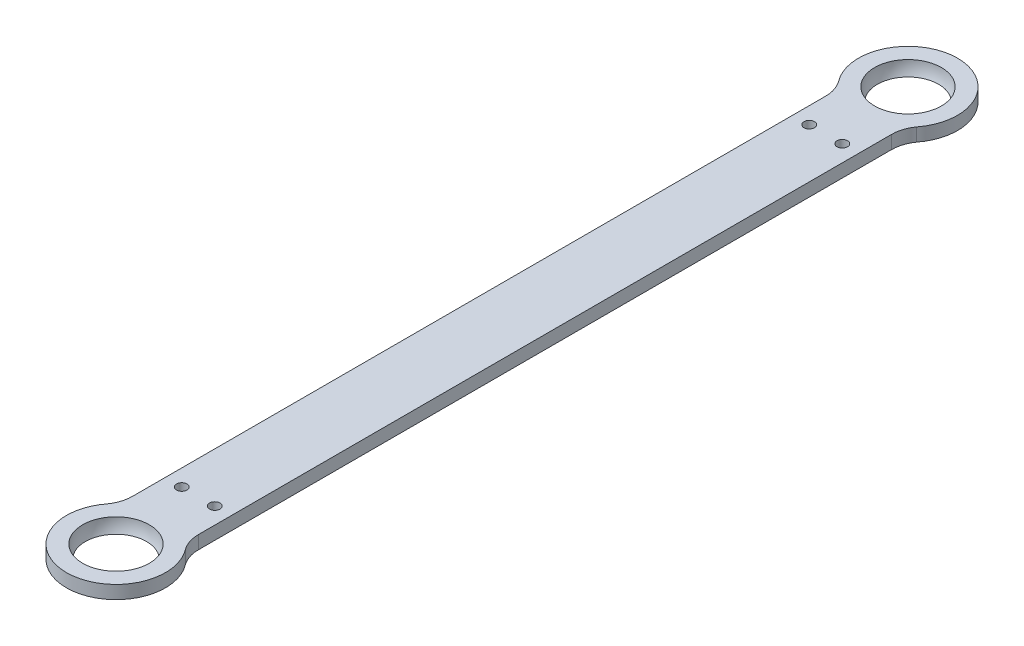
ISO-10303-21;
HEADER;
FILE_DESCRIPTION(('STEP AP214'),'2;1');
FILE_NAME('part.step','',(''),(''),'','','');
FILE_SCHEMA(('AUTOMOTIVE_DESIGN { 1 0 10303 214 1 1 1 1 }'));
ENDSEC;
DATA;
#1=APPLICATION_CONTEXT('core data for automotive mechanical design processes');
#2=APPLICATION_PROTOCOL_DEFINITION('international standard','automotive_design',2000,#1);
#3=PRODUCT_CONTEXT('',#1,'mechanical');
#4=PRODUCT('Part','Part','',(#3));
#5=PRODUCT_RELATED_PRODUCT_CATEGORY('part','',(#4));
#6=PRODUCT_DEFINITION_FORMATION('','',#4);
#7=PRODUCT_DEFINITION_CONTEXT('part definition',#1,'design');
#8=PRODUCT_DEFINITION('design','',#6,#7);
#9=PRODUCT_DEFINITION_SHAPE('','',#8);
#10=(LENGTH_UNIT() NAMED_UNIT(*) SI_UNIT(.MILLI.,.METRE.));
#11=(NAMED_UNIT(*) PLANE_ANGLE_UNIT() SI_UNIT($,.RADIAN.));
#12=(NAMED_UNIT(*) SI_UNIT($,.STERADIAN.) SOLID_ANGLE_UNIT());
#13=UNCERTAINTY_MEASURE_WITH_UNIT(LENGTH_MEASURE(1.E-05),#10,'distance_accuracy_value','');
#14=(GEOMETRIC_REPRESENTATION_CONTEXT(3) GLOBAL_UNCERTAINTY_ASSIGNED_CONTEXT((#13)) GLOBAL_UNIT_ASSIGNED_CONTEXT((#10,
#11,#12)) REPRESENTATION_CONTEXT('',''));
#15=CARTESIAN_POINT('',(0.,0.,0.));
#16=DIRECTION('',(0.,0.,1.));
#17=DIRECTION('',(1.,0.,0.));
#18=AXIS2_PLACEMENT_3D('',#15,#16,#17);
#19=CARTESIAN_POINT('',(10.,4.,15.));
#20=DIRECTION('',(-1.,0.,0.));
#21=DIRECTION('',(0.,0.,1.));
#22=AXIS2_PLACEMENT_3D('',#19,#20,#21);
#23=PLANE('',#22);
#24=DIRECTION('',(0.,0.,-1.));
#25=VECTOR('',#24,1.);
#26=CARTESIAN_POINT('',(10.,4.,15.));
#27=LINE('',#26,#25);
#28=CARTESIAN_POINT('',(10.,4.,224.807386353478));
#29=VERTEX_POINT('',#28);
#30=CARTESIAN_POINT('',(10.,4.,15.));
#31=VERTEX_POINT('',#30);
#32=EDGE_CURVE('E92',#29,#31,#27,.T.);
#33=ORIENTED_EDGE('',*,*,#32,.F.);
#34=DIRECTION('',(0.,-1.,0.));
#35=VECTOR('',#34,1.);
#36=CARTESIAN_POINT('',(10.,4.,224.807386353478));
#37=LINE('',#36,#35);
#38=CARTESIAN_POINT('',(10.,0.,224.807386353478));
#39=VERTEX_POINT('',#38);
#40=EDGE_CURVE('E118',#29,#39,#37,.T.);
#41=ORIENTED_EDGE('',*,*,#40,.T.);
#42=DIRECTION('',(0.,0.,-1.));
#43=VECTOR('',#42,1.);
#44=CARTESIAN_POINT('',(10.,0.,15.));
#45=LINE('',#44,#43);
#46=CARTESIAN_POINT('',(10.,0.,15.));
#47=VERTEX_POINT('',#46);
#48=EDGE_CURVE('E163',#39,#47,#45,.T.);
#49=ORIENTED_EDGE('',*,*,#48,.T.);
#50=DIRECTION('',(0.,-1.,0.));
#51=VECTOR('',#50,1.);
#52=CARTESIAN_POINT('',(10.,4.,15.));
#53=LINE('',#52,#51);
#54=EDGE_CURVE('E11',#31,#47,#53,.T.);
#55=ORIENTED_EDGE('',*,*,#54,.F.);
#56=EDGE_LOOP('',(#33,#41,#49,#55));
#57=FACE_BOUND('',#56,.T.);
#58=ADVANCED_FACE('F44',(#57),#23,.F.);
#59=CARTESIAN_POINT('',(20.0290905482833,4.,15.));
#60=DIRECTION('',(0.,-1.,0.));
#61=DIRECTION('',(0.,0.,-1.));
#62=AXIS2_PLACEMENT_3D('',#59,#60,#61);
#63=CYLINDRICAL_SURFACE('',#62,10.0290905482833);
#64=CARTESIAN_POINT('',(20.0290905482833,0.,15.));
#65=DIRECTION('',(0.,-1.,0.));
#66=DIRECTION('',(0.,0.,-1.));
#67=AXIS2_PLACEMENT_3D('',#64,#65,#66);
#68=CIRCLE('',#67,10.0290905482833);
#69=CARTESIAN_POINT('',(11.8459761773143,0.,9.20178506630661));
#70=VERTEX_POINT('',#69);
#71=EDGE_CURVE('E173',#47,#70,#68,.T.);
#72=ORIENTED_EDGE('',*,*,#71,.T.);
#73=DIRECTION('',(0.,-1.,0.));
#74=VECTOR('',#73,1.);
#75=CARTESIAN_POINT('',(11.8459761773143,4.,9.20178506630661));
#76=LINE('',#75,#74);
#77=CARTESIAN_POINT('',(11.8459761773143,4.,9.20178506630661));
#78=VERTEX_POINT('',#77);
#79=EDGE_CURVE('E53',#78,#70,#76,.T.);
#80=ORIENTED_EDGE('',*,*,#79,.F.);
#81=CARTESIAN_POINT('',(20.0290905482833,4.,15.));
#82=DIRECTION('',(0.,-1.,0.));
#83=DIRECTION('',(0.,0.,-1.));
#84=AXIS2_PLACEMENT_3D('',#81,#82,#83);
#85=CIRCLE('',#84,10.0290905482833);
#86=EDGE_CURVE('E120',#31,#78,#85,.T.);
#87=ORIENTED_EDGE('',*,*,#86,.F.);
#88=ORIENTED_EDGE('',*,*,#54,.T.);
#89=EDGE_LOOP('',(#72,#80,#87,#88));
#90=FACE_BOUND('',#89,.T.);
#91=ADVANCED_FACE('F244',(#90),#63,.F.);
#92=CARTESIAN_POINT('',(0.,4.,0.));
#93=DIRECTION('',(0.,-1.,0.));
#94=DIRECTION('',(0.,0.,-1.));
#95=AXIS2_PLACEMENT_3D('',#92,#93,#94);
#96=CYLINDRICAL_SURFACE('',#95,15.);
#97=CARTESIAN_POINT('',(0.,0.,0.));
#98=DIRECTION('',(0.,1.,0.));
#99=DIRECTION('',(0.,0.,1.));
#100=AXIS2_PLACEMENT_3D('',#97,#98,#99);
#101=CIRCLE('',#100,15.);
#102=CARTESIAN_POINT('',(-11.8459761773142,0.,9.20178506630661));
#103=VERTEX_POINT('',#102);
#104=EDGE_CURVE('E79',#70,#103,#101,.T.);
#105=ORIENTED_EDGE('',*,*,#104,.T.);
#106=DIRECTION('',(0.,-1.,0.));
#107=VECTOR('',#106,1.);
#108=CARTESIAN_POINT('',(-11.8459761773142,4.,9.20178506630661));
#109=LINE('',#108,#107);
#110=CARTESIAN_POINT('',(-11.8459761773142,4.,9.20178506630661));
#111=VERTEX_POINT('',#110);
#112=EDGE_CURVE('E179',#111,#103,#109,.T.);
#113=ORIENTED_EDGE('',*,*,#112,.F.);
#114=CARTESIAN_POINT('',(0.,4.,0.));
#115=DIRECTION('',(0.,1.,0.));
#116=DIRECTION('',(0.,0.,1.));
#117=AXIS2_PLACEMENT_3D('',#114,#115,#116);
#118=CIRCLE('',#117,15.);
#119=EDGE_CURVE('E166',#78,#111,#118,.T.);
#120=ORIENTED_EDGE('',*,*,#119,.F.);
#121=ORIENTED_EDGE('',*,*,#79,.T.);
#122=EDGE_LOOP('',(#105,#113,#120,#121));
#123=FACE_BOUND('',#122,.T.);
#124=ADVANCED_FACE('F183',(#123),#96,.T.);
#125=CARTESIAN_POINT('',(-20.0290905482833,4.,15.));
#126=DIRECTION('',(0.,-1.,0.));
#127=DIRECTION('',(0.,0.,-1.));
#128=AXIS2_PLACEMENT_3D('',#125,#126,#127);
#129=CYLINDRICAL_SURFACE('',#128,10.0290905482833);
#130=CARTESIAN_POINT('',(-20.0290905482833,0.,15.));
#131=DIRECTION('',(0.,-1.,0.));
#132=DIRECTION('',(0.,0.,1.));
#133=AXIS2_PLACEMENT_3D('',#130,#131,#132);
#134=CIRCLE('',#133,10.0290905482833);
#135=CARTESIAN_POINT('',(-10.,0.,15.));
#136=VERTEX_POINT('',#135);
#137=EDGE_CURVE('E85',#103,#136,#134,.T.);
#138=ORIENTED_EDGE('',*,*,#137,.T.);
#139=DIRECTION('',(0.,-1.,0.));
#140=VECTOR('',#139,1.);
#141=CARTESIAN_POINT('',(-10.,4.,15.));
#142=LINE('',#141,#140);
#143=CARTESIAN_POINT('',(-10.,4.,15.));
#144=VERTEX_POINT('',#143);
#145=EDGE_CURVE('E171',#144,#136,#142,.T.);
#146=ORIENTED_EDGE('',*,*,#145,.F.);
#147=CARTESIAN_POINT('',(-20.0290905482833,4.,15.));
#148=DIRECTION('',(0.,-1.,0.));
#149=DIRECTION('',(0.,0.,1.));
#150=AXIS2_PLACEMENT_3D('',#147,#148,#149);
#151=CIRCLE('',#150,10.0290905482833);
#152=EDGE_CURVE('E61',#111,#144,#151,.T.);
#153=ORIENTED_EDGE('',*,*,#152,.F.);
#154=ORIENTED_EDGE('',*,*,#112,.T.);
#155=EDGE_LOOP('',(#138,#146,#153,#154));
#156=FACE_BOUND('',#155,.T.);
#157=ADVANCED_FACE('F251',(#156),#129,.F.);
#158=CARTESIAN_POINT('',(-10.,4.,15.));
#159=DIRECTION('',(1.,0.,0.));
#160=DIRECTION('',(0.,0.,-1.));
#161=AXIS2_PLACEMENT_3D('',#158,#159,#160);
#162=PLANE('',#161);
#163=DIRECTION('',(0.,0.,1.));
#164=VECTOR('',#163,1.);
#165=CARTESIAN_POINT('',(-10.,0.,15.));
#166=LINE('',#165,#164);
#167=CARTESIAN_POINT('',(-10.,0.,224.807386353478));
#168=VERTEX_POINT('',#167);
#169=EDGE_CURVE('E121',#136,#168,#166,.T.);
#170=ORIENTED_EDGE('',*,*,#169,.T.);
#171=DIRECTION('',(0.,-1.,0.));
#172=VECTOR('',#171,1.);
#173=CARTESIAN_POINT('',(-10.,4.,224.807386353478));
#174=LINE('',#173,#172);
#175=CARTESIAN_POINT('',(-10.,4.,224.807386353478));
#176=VERTEX_POINT('',#175);
#177=EDGE_CURVE('E197',#176,#168,#174,.T.);
#178=ORIENTED_EDGE('',*,*,#177,.F.);
#179=DIRECTION('',(0.,0.,1.));
#180=VECTOR('',#179,1.);
#181=CARTESIAN_POINT('',(-10.,4.,15.));
#182=LINE('',#181,#180);
#183=EDGE_CURVE('E169',#144,#176,#182,.T.);
#184=ORIENTED_EDGE('',*,*,#183,.F.);
#185=ORIENTED_EDGE('',*,*,#145,.T.);
#186=EDGE_LOOP('',(#170,#178,#184,#185));
#187=FACE_BOUND('',#186,.T.);
#188=ADVANCED_FACE('F195',(#187),#162,.F.);
#189=CARTESIAN_POINT('',(20.0290905482833,4.,15.));
#190=DIRECTION('',(0.,-1.,0.));
#191=DIRECTION('',(0.,0.,-1.));
#192=AXIS2_PLACEMENT_3D('',#189,#190,#191);
#193=PLANE('',#192);
#194=CARTESIAN_POINT('',(0.,4.,0.));
#195=DIRECTION('',(0.,-1.,0.));
#196=DIRECTION('',(0.,0.,-1.));
#197=AXIS2_PLACEMENT_3D('',#194,#195,#196);
#198=CIRCLE('',#197,10.1);
#199=CARTESIAN_POINT('',(0.,4.,-10.1));
#200=VERTEX_POINT('',#199);
#201=EDGE_CURVE('E161',#200,#200,#198,.F.);
#202=ORIENTED_EDGE('',*,*,#201,.F.);
#203=EDGE_LOOP('',(#202));
#204=FACE_BOUND('',#203,.T.);
#205=ORIENTED_EDGE('',*,*,#183,.T.);
#206=CARTESIAN_POINT('',(-20.0290905482833,4.,224.807386353478));
#207=DIRECTION('',(0.,1.,0.));
#208=DIRECTION('',(0.,0.,-1.));
#209=AXIS2_PLACEMENT_3D('',#206,#207,#208);
#210=CIRCLE('',#209,10.0290905482833);
#211=CARTESIAN_POINT('',(-11.8459761773142,4.,230.605601287171));
#212=VERTEX_POINT('',#211);
#213=EDGE_CURVE('E203',#212,#176,#210,.T.);
#214=ORIENTED_EDGE('',*,*,#213,.F.);
#215=CARTESIAN_POINT('',(0.,4.,239.807386353478));
#216=DIRECTION('',(0.,-1.,0.));
#217=DIRECTION('',(0.,0.,-1.));
#218=AXIS2_PLACEMENT_3D('',#215,#216,#217);
#219=CIRCLE('',#218,15.);
#220=CARTESIAN_POINT('',(11.8459761773143,4.,230.605601287171));
#221=VERTEX_POINT('',#220);
#222=EDGE_CURVE('E128',#221,#212,#219,.T.);
#223=ORIENTED_EDGE('',*,*,#222,.F.);
#224=CARTESIAN_POINT('',(20.0290905482833,4.,224.807386353478));
#225=DIRECTION('',(0.,1.,0.));
#226=DIRECTION('',(0.,0.,1.));
#227=AXIS2_PLACEMENT_3D('',#224,#225,#226);
#228=CIRCLE('',#227,10.0290905482833);
#229=EDGE_CURVE('E124',#29,#221,#228,.T.);
#230=ORIENTED_EDGE('',*,*,#229,.F.);
#231=ORIENTED_EDGE('',*,*,#32,.T.);
#232=ORIENTED_EDGE('',*,*,#86,.T.);
#233=ORIENTED_EDGE('',*,*,#119,.T.);
#234=ORIENTED_EDGE('',*,*,#152,.T.);
#235=EDGE_LOOP('',(#205,#214,#223,#230,#231,#232,#233,#234));
#236=FACE_BOUND('',#235,.T.);
#237=CARTESIAN_POINT('',(-5.00000000000001,4.,24.9018465883695));
#238=DIRECTION('',(0.,-1.,0.));
#239=DIRECTION('',(0.,0.,-1.));
#240=AXIS2_PLACEMENT_3D('',#237,#238,#239);
#241=CIRCLE('',#240,1.6);
#242=CARTESIAN_POINT('',(-5.00000000000001,4.,23.3018465883695));
#243=VERTEX_POINT('',#242);
#244=EDGE_CURVE('E138',#243,#243,#241,.F.);
#245=ORIENTED_EDGE('',*,*,#244,.F.);
#246=EDGE_LOOP('',(#245));
#247=FACE_BOUND('',#246,.T.);
#248=CARTESIAN_POINT('',(5.,4.,24.9018465883695));
#249=DIRECTION('',(0.,-1.,0.));
#250=DIRECTION('',(0.,0.,-1.));
#251=AXIS2_PLACEMENT_3D('',#248,#249,#250);
#252=CIRCLE('',#251,1.6);
#253=CARTESIAN_POINT('',(5.,4.,23.3018465883695));
#254=VERTEX_POINT('',#253);
#255=EDGE_CURVE('E142',#254,#254,#252,.F.);
#256=ORIENTED_EDGE('',*,*,#255,.F.);
#257=EDGE_LOOP('',(#256));
#258=FACE_BOUND('',#257,.T.);
#259=CARTESIAN_POINT('',(0.,4.,239.807386353478));
#260=DIRECTION('',(0.,1.,0.));
#261=DIRECTION('',(0.,0.,1.));
#262=AXIS2_PLACEMENT_3D('',#259,#260,#261);
#263=CIRCLE('',#262,10.1);
#264=CARTESIAN_POINT('',(0.,4.,249.907386353478));
#265=VERTEX_POINT('',#264);
#266=EDGE_CURVE('E150',#265,#265,#263,.F.);
#267=ORIENTED_EDGE('',*,*,#266,.T.);
#268=EDGE_LOOP('',(#267));
#269=FACE_BOUND('',#268,.T.);
#270=CARTESIAN_POINT('',(-5.00000000000001,4.,214.905539765108));
#271=DIRECTION('',(0.,1.,0.));
#272=DIRECTION('',(0.,0.,1.));
#273=AXIS2_PLACEMENT_3D('',#270,#271,#272);
#274=CIRCLE('',#273,1.6);
#275=CARTESIAN_POINT('',(-5.00000000000001,4.,216.505539765108));
#276=VERTEX_POINT('',#275);
#277=EDGE_CURVE('E222',#276,#276,#274,.F.);
#278=ORIENTED_EDGE('',*,*,#277,.T.);
#279=EDGE_LOOP('',(#278));
#280=FACE_BOUND('',#279,.T.);
#281=CARTESIAN_POINT('',(5.,4.,214.905539765108));
#282=DIRECTION('',(0.,1.,0.));
#283=DIRECTION('',(0.,0.,1.));
#284=AXIS2_PLACEMENT_3D('',#281,#282,#283);
#285=CIRCLE('',#284,1.6);
#286=CARTESIAN_POINT('',(5.,4.,216.505539765108));
#287=VERTEX_POINT('',#286);
#288=EDGE_CURVE('E219',#287,#287,#285,.F.);
#289=ORIENTED_EDGE('',*,*,#288,.T.);
#290=EDGE_LOOP('',(#289));
#291=FACE_BOUND('',#290,.T.);
#292=ADVANCED_FACE('F125',(#204,#236,#247,#258,#269,#280,#291),#193,.F.);
#293=CARTESIAN_POINT('',(20.0290905482833,0.,15.));
#294=DIRECTION('',(0.,-1.,0.));
#295=DIRECTION('',(0.,0.,-1.));
#296=AXIS2_PLACEMENT_3D('',#293,#294,#295);
#297=PLANE('',#296);
#298=CARTESIAN_POINT('',(5.,0.,24.9018465883695));
#299=DIRECTION('',(0.,-1.,0.));
#300=DIRECTION('',(0.,0.,-1.));
#301=AXIS2_PLACEMENT_3D('',#298,#299,#300);
#302=CIRCLE('',#301,1.6);
#303=CARTESIAN_POINT('',(5.,0.,23.3018465883695));
#304=VERTEX_POINT('',#303);
#305=EDGE_CURVE('E158',#304,#304,#302,.T.);
#306=ORIENTED_EDGE('',*,*,#305,.F.);
#307=EDGE_LOOP('',(#306));
#308=FACE_BOUND('',#307,.T.);
#309=CARTESIAN_POINT('',(-5.00000000000001,0.,24.9018465883695));
#310=DIRECTION('',(0.,-1.,0.));
#311=DIRECTION('',(0.,0.,-1.));
#312=AXIS2_PLACEMENT_3D('',#309,#310,#311);
#313=CIRCLE('',#312,1.6);
#314=CARTESIAN_POINT('',(-5.00000000000001,0.,23.3018465883695));
#315=VERTEX_POINT('',#314);
#316=EDGE_CURVE('E155',#315,#315,#313,.T.);
#317=ORIENTED_EDGE('',*,*,#316,.F.);
#318=EDGE_LOOP('',(#317));
#319=FACE_BOUND('',#318,.T.);
#320=CARTESIAN_POINT('',(0.,0.,0.));
#321=DIRECTION('',(0.,-1.,0.));
#322=DIRECTION('',(0.,0.,-1.));
#323=AXIS2_PLACEMENT_3D('',#320,#321,#322);
#324=CIRCLE('',#323,9.27415764368926);
#325=CARTESIAN_POINT('',(0.,0.,-9.27415764368926));
#326=VERTEX_POINT('',#325);
#327=EDGE_CURVE('E47',#326,#326,#324,.F.);
#328=ORIENTED_EDGE('',*,*,#327,.T.);
#329=EDGE_LOOP('',(#328));
#330=FACE_BOUND('',#329,.T.);
#331=ORIENTED_EDGE('',*,*,#48,.F.);
#332=CARTESIAN_POINT('',(20.0290905482833,0.,224.807386353478));
#333=DIRECTION('',(0.,1.,0.));
#334=DIRECTION('',(0.,0.,1.));
#335=AXIS2_PLACEMENT_3D('',#332,#333,#334);
#336=CIRCLE('',#335,10.0290905482833);
#337=CARTESIAN_POINT('',(11.8459761773143,0.,230.605601287171));
#338=VERTEX_POINT('',#337);
#339=EDGE_CURVE('E137',#39,#338,#336,.T.);
#340=ORIENTED_EDGE('',*,*,#339,.T.);
#341=CARTESIAN_POINT('',(0.,0.,239.807386353478));
#342=DIRECTION('',(0.,-1.,0.));
#343=DIRECTION('',(0.,0.,-1.));
#344=AXIS2_PLACEMENT_3D('',#341,#342,#343);
#345=CIRCLE('',#344,15.);
#346=CARTESIAN_POINT('',(-11.8459761773142,0.,230.605601287171));
#347=VERTEX_POINT('',#346);
#348=EDGE_CURVE('E208',#338,#347,#345,.T.);
#349=ORIENTED_EDGE('',*,*,#348,.T.);
#350=CARTESIAN_POINT('',(-20.0290905482833,0.,224.807386353478));
#351=DIRECTION('',(0.,1.,0.));
#352=DIRECTION('',(0.,0.,-1.));
#353=AXIS2_PLACEMENT_3D('',#350,#351,#352);
#354=CIRCLE('',#353,10.0290905482833);
#355=EDGE_CURVE('E132',#347,#168,#354,.T.);
#356=ORIENTED_EDGE('',*,*,#355,.T.);
#357=ORIENTED_EDGE('',*,*,#169,.F.);
#358=ORIENTED_EDGE('',*,*,#137,.F.);
#359=ORIENTED_EDGE('',*,*,#104,.F.);
#360=ORIENTED_EDGE('',*,*,#71,.F.);
#361=EDGE_LOOP('',(#331,#340,#349,#356,#357,#358,#359,#360));
#362=FACE_BOUND('',#361,.T.);
#363=CARTESIAN_POINT('',(5.,0.,214.905539765108));
#364=DIRECTION('',(0.,1.,0.));
#365=DIRECTION('',(0.,0.,1.));
#366=AXIS2_PLACEMENT_3D('',#363,#364,#365);
#367=CIRCLE('',#366,1.6);
#368=CARTESIAN_POINT('',(5.,0.,216.505539765108));
#369=VERTEX_POINT('',#368);
#370=EDGE_CURVE('E151',#369,#369,#367,.T.);
#371=ORIENTED_EDGE('',*,*,#370,.T.);
#372=EDGE_LOOP('',(#371));
#373=FACE_BOUND('',#372,.T.);
#374=CARTESIAN_POINT('',(-5.00000000000001,0.,214.905539765108));
#375=DIRECTION('',(0.,1.,0.));
#376=DIRECTION('',(0.,0.,1.));
#377=AXIS2_PLACEMENT_3D('',#374,#375,#376);
#378=CIRCLE('',#377,1.6);
#379=CARTESIAN_POINT('',(-5.00000000000001,0.,216.505539765108));
#380=VERTEX_POINT('',#379);
#381=EDGE_CURVE('E216',#380,#380,#378,.T.);
#382=ORIENTED_EDGE('',*,*,#381,.T.);
#383=EDGE_LOOP('',(#382));
#384=FACE_BOUND('',#383,.T.);
#385=CARTESIAN_POINT('',(0.,0.,239.807386353478));
#386=DIRECTION('',(0.,1.,0.));
#387=DIRECTION('',(0.,0.,1.));
#388=AXIS2_PLACEMENT_3D('',#385,#386,#387);
#389=CIRCLE('',#388,9.27415764368926);
#390=CARTESIAN_POINT('',(0.,0.,249.081543997167));
#391=VERTEX_POINT('',#390);
#392=EDGE_CURVE('E148',#391,#391,#389,.F.);
#393=ORIENTED_EDGE('',*,*,#392,.F.);
#394=EDGE_LOOP('',(#393));
#395=FACE_BOUND('',#394,.T.);
#396=ADVANCED_FACE('F187',(#308,#319,#330,#362,#373,#384,#395),#297,.T.);
#397=CARTESIAN_POINT('',(0.,4.,0.));
#398=DIRECTION('',(0.,0.,-1.));
#399=DIRECTION('',(1.,0.,0.));
#400=AXIS2_PLACEMENT_3D('',#397,#398,#399);
#401=SPHERICAL_SURFACE('',#400,10.1);
#402=CARTESIAN_POINT('',(0.,4.,0.));
#403=DIRECTION('',(0.,-1.,0.));
#404=DIRECTION('',(0.,0.,-1.));
#405=AXIS2_PLACEMENT_3D('',#402,#403,#404);
#406=SPHERICAL_SURFACE('',#405,10.1);
#407=ORIENTED_EDGE('',*,*,#327,.F.);
#408=EDGE_LOOP('',(#407));
#409=FACE_BOUND('',#408,.T.);
#410=ORIENTED_EDGE('',*,*,#201,.T.);
#411=EDGE_LOOP('',(#410));
#412=FACE_BOUND('',#411,.T.);
#413=ADVANCED_FACE('F260',(#409,#412),#406,.F.);
#414=CARTESIAN_POINT('',(-5.00000000000001,-7.,24.9018465883695));
#415=DIRECTION('',(0.,1.,0.));
#416=DIRECTION('',(0.,0.,1.));
#417=AXIS2_PLACEMENT_3D('',#414,#415,#416);
#418=CYLINDRICAL_SURFACE('',#417,1.6);
#419=ORIENTED_EDGE('',*,*,#316,.T.);
#420=EDGE_LOOP('',(#419));
#421=FACE_BOUND('',#420,.T.);
#422=ORIENTED_EDGE('',*,*,#244,.T.);
#423=EDGE_LOOP('',(#422));
#424=FACE_BOUND('',#423,.T.);
#425=ADVANCED_FACE('F267',(#421,#424),#418,.F.);
#426=CARTESIAN_POINT('',(5.,-7.,24.9018465883695));
#427=DIRECTION('',(0.,1.,0.));
#428=DIRECTION('',(0.,0.,1.));
#429=AXIS2_PLACEMENT_3D('',#426,#427,#428);
#430=CYLINDRICAL_SURFACE('',#429,1.6);
#431=ORIENTED_EDGE('',*,*,#305,.T.);
#432=EDGE_LOOP('',(#431));
#433=FACE_BOUND('',#432,.T.);
#434=ORIENTED_EDGE('',*,*,#255,.T.);
#435=EDGE_LOOP('',(#434));
#436=FACE_BOUND('',#435,.T.);
#437=ADVANCED_FACE('F271',(#433,#436),#430,.F.);
#438=CARTESIAN_POINT('',(20.0290905482833,4.,224.807386353478));
#439=DIRECTION('',(0.,-1.,0.));
#440=DIRECTION('',(0.,0.,1.));
#441=AXIS2_PLACEMENT_3D('',#438,#439,#440);
#442=CYLINDRICAL_SURFACE('',#441,10.0290905482833);
#443=ORIENTED_EDGE('',*,*,#339,.F.);
#444=ORIENTED_EDGE('',*,*,#40,.F.);
#445=ORIENTED_EDGE('',*,*,#229,.T.);
#446=DIRECTION('',(0.,-1.,0.));
#447=VECTOR('',#446,1.);
#448=CARTESIAN_POINT('',(11.8459761773143,4.,230.605601287171));
#449=LINE('',#448,#447);
#450=EDGE_CURVE('E139',#221,#338,#449,.T.);
#451=ORIENTED_EDGE('',*,*,#450,.T.);
#452=EDGE_LOOP('',(#443,#444,#445,#451));
#453=FACE_BOUND('',#452,.T.);
#454=ADVANCED_FACE('F135',(#453),#442,.F.);
#455=CARTESIAN_POINT('',(0.,4.,239.807386353478));
#456=DIRECTION('',(0.,-1.,0.));
#457=DIRECTION('',(0.,0.,1.));
#458=AXIS2_PLACEMENT_3D('',#455,#456,#457);
#459=CYLINDRICAL_SURFACE('',#458,15.);
#460=ORIENTED_EDGE('',*,*,#348,.F.);
#461=ORIENTED_EDGE('',*,*,#450,.F.);
#462=ORIENTED_EDGE('',*,*,#222,.T.);
#463=DIRECTION('',(0.,-1.,0.));
#464=VECTOR('',#463,1.);
#465=CARTESIAN_POINT('',(-11.8459761773142,4.,230.605601287171));
#466=LINE('',#465,#464);
#467=EDGE_CURVE('E144',#212,#347,#466,.T.);
#468=ORIENTED_EDGE('',*,*,#467,.T.);
#469=EDGE_LOOP('',(#460,#461,#462,#468));
#470=FACE_BOUND('',#469,.T.);
#471=ADVANCED_FACE('F278',(#470),#459,.T.);
#472=CARTESIAN_POINT('',(-20.0290905482833,4.,224.807386353478));
#473=DIRECTION('',(0.,-1.,0.));
#474=DIRECTION('',(0.,0.,1.));
#475=AXIS2_PLACEMENT_3D('',#472,#473,#474);
#476=CYLINDRICAL_SURFACE('',#475,10.0290905482833);
#477=ORIENTED_EDGE('',*,*,#355,.F.);
#478=ORIENTED_EDGE('',*,*,#467,.F.);
#479=ORIENTED_EDGE('',*,*,#213,.T.);
#480=ORIENTED_EDGE('',*,*,#177,.T.);
#481=EDGE_LOOP('',(#477,#478,#479,#480));
#482=FACE_BOUND('',#481,.T.);
#483=ADVANCED_FACE('F200',(#482),#476,.F.);
#484=CARTESIAN_POINT('',(0.,4.,239.807386353478));
#485=DIRECTION('',(0.,0.,1.));
#486=DIRECTION('',(1.,0.,0.));
#487=AXIS2_PLACEMENT_3D('',#484,#485,#486);
#488=SPHERICAL_SURFACE('',#487,10.1);
#489=CARTESIAN_POINT('',(0.,4.,239.807386353478));
#490=DIRECTION('',(0.,1.,0.));
#491=DIRECTION('',(0.,0.,1.));
#492=AXIS2_PLACEMENT_3D('',#489,#490,#491);
#493=SPHERICAL_SURFACE('',#492,10.1);
#494=ORIENTED_EDGE('',*,*,#392,.T.);
#495=EDGE_LOOP('',(#494));
#496=FACE_BOUND('',#495,.T.);
#497=ORIENTED_EDGE('',*,*,#266,.F.);
#498=EDGE_LOOP('',(#497));
#499=FACE_BOUND('',#498,.T.);
#500=ADVANCED_FACE('F231',(#496,#499),#493,.F.);
#501=CARTESIAN_POINT('',(-5.00000000000001,-7.,214.905539765108));
#502=DIRECTION('',(0.,1.,0.));
#503=DIRECTION('',(0.,0.,-1.));
#504=AXIS2_PLACEMENT_3D('',#501,#502,#503);
#505=CYLINDRICAL_SURFACE('',#504,1.6);
#506=ORIENTED_EDGE('',*,*,#381,.F.);
#507=EDGE_LOOP('',(#506));
#508=FACE_BOUND('',#507,.T.);
#509=ORIENTED_EDGE('',*,*,#277,.F.);
#510=EDGE_LOOP('',(#509));
#511=FACE_BOUND('',#510,.T.);
#512=ADVANCED_FACE('F228',(#508,#511),#505,.F.);
#513=CARTESIAN_POINT('',(5.,-7.,214.905539765108));
#514=DIRECTION('',(0.,1.,0.));
#515=DIRECTION('',(0.,0.,-1.));
#516=AXIS2_PLACEMENT_3D('',#513,#514,#515);
#517=CYLINDRICAL_SURFACE('',#516,1.6);
#518=ORIENTED_EDGE('',*,*,#370,.F.);
#519=EDGE_LOOP('',(#518));
#520=FACE_BOUND('',#519,.T.);
#521=ORIENTED_EDGE('',*,*,#288,.F.);
#522=EDGE_LOOP('',(#521));
#523=FACE_BOUND('',#522,.T.);
#524=ADVANCED_FACE('F230',(#520,#523),#517,.F.);
#525=CLOSED_SHELL('',(#58,#91,#124,#157,#188,#292,#396,#413,#425,#437,#454,#471,#483,#500,#512,#524));
#526=MANIFOLD_SOLID_BREP('B2',#525);
#527=ADVANCED_BREP_SHAPE_REPRESENTATION('',(#18,#526),#14);
#528=SHAPE_DEFINITION_REPRESENTATION(#9,#527);
ENDSEC;
END-ISO-10303-21;
